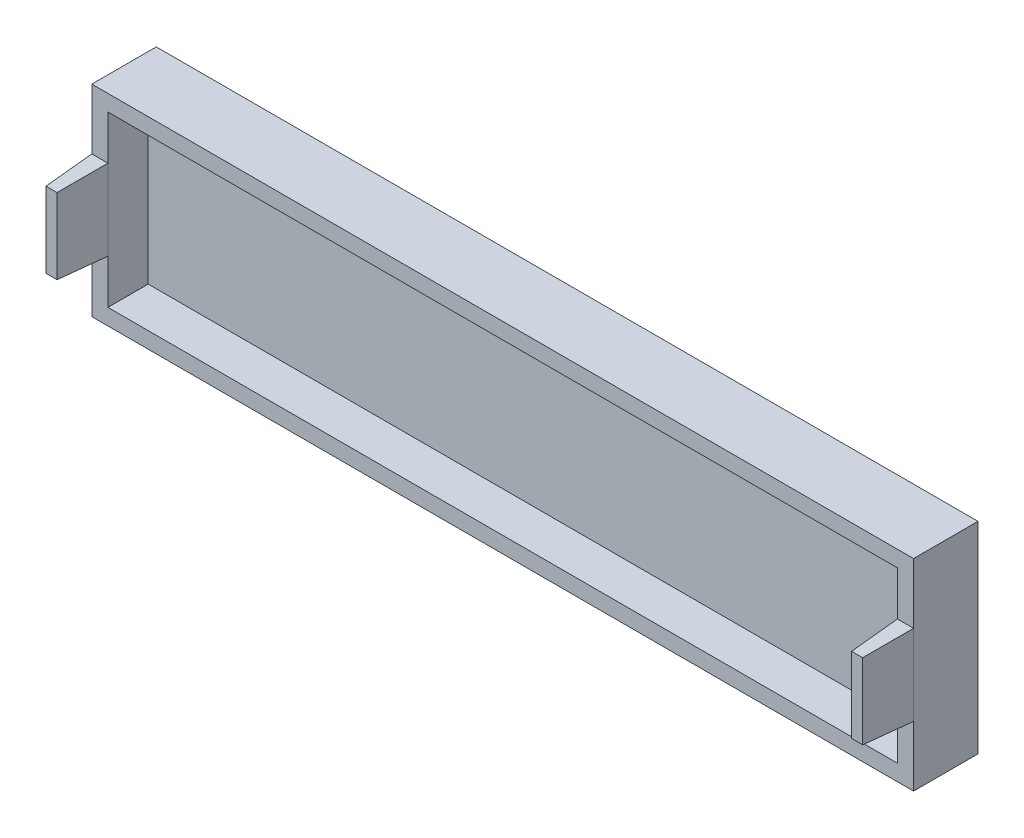
ISO-10303-21;
HEADER;
FILE_DESCRIPTION(('STEP AP214'),'2;1');
FILE_NAME('part.step','',(''),(''),'','','');
FILE_SCHEMA(('AUTOMOTIVE_DESIGN { 1 0 10303 214 1 1 1 1 }'));
ENDSEC;
DATA;
#1=APPLICATION_CONTEXT('core data for automotive mechanical design processes');
#2=APPLICATION_PROTOCOL_DEFINITION('international standard','automotive_design',2000,#1);
#3=PRODUCT_CONTEXT('',#1,'mechanical');
#4=PRODUCT('Part','Part','',(#3));
#5=PRODUCT_RELATED_PRODUCT_CATEGORY('part','',(#4));
#6=PRODUCT_DEFINITION_FORMATION('','',#4);
#7=PRODUCT_DEFINITION_CONTEXT('part definition',#1,'design');
#8=PRODUCT_DEFINITION('design','',#6,#7);
#9=PRODUCT_DEFINITION_SHAPE('','',#8);
#10=(LENGTH_UNIT() NAMED_UNIT(*) SI_UNIT(.MILLI.,.METRE.));
#11=(NAMED_UNIT(*) PLANE_ANGLE_UNIT() SI_UNIT($,.RADIAN.));
#12=(NAMED_UNIT(*) SI_UNIT($,.STERADIAN.) SOLID_ANGLE_UNIT());
#13=UNCERTAINTY_MEASURE_WITH_UNIT(LENGTH_MEASURE(1.E-05),#10,'distance_accuracy_value','');
#14=(GEOMETRIC_REPRESENTATION_CONTEXT(3) GLOBAL_UNCERTAINTY_ASSIGNED_CONTEXT((#13)) GLOBAL_UNIT_ASSIGNED_CONTEXT((#10,
#11,#12)) REPRESENTATION_CONTEXT('',''));
#15=CARTESIAN_POINT('',(0.,0.,0.));
#16=DIRECTION('',(0.,0.,1.));
#17=DIRECTION('',(1.,0.,0.));
#18=AXIS2_PLACEMENT_3D('',#15,#16,#17);
#19=CARTESIAN_POINT('',(0.,0.,8.));
#20=DIRECTION('',(0.,0.,1.));
#21=DIRECTION('',(1.,0.,0.));
#22=AXIS2_PLACEMENT_3D('',#19,#20,#21);
#23=PLANE('',#22);
#24=DIRECTION('',(1.,0.,0.));
#25=VECTOR('',#24,1.);
#26=CARTESIAN_POINT('',(51.,4.99999999999999,8.));
#27=LINE('',#26,#25);
#28=CARTESIAN_POINT('',(49.,4.99999999999999,8.));
#29=VERTEX_POINT('',#28);
#30=CARTESIAN_POINT('',(51.,4.99999999999999,8.));
#31=VERTEX_POINT('',#30);
#32=EDGE_CURVE('E49',#29,#31,#27,.T.);
#33=ORIENTED_EDGE('',*,*,#32,.T.);
#34=DIRECTION('',(0.,1.,0.));
#35=VECTOR('',#34,1.);
#36=CARTESIAN_POINT('',(51.,-12.5,8.));
#37=LINE('',#36,#35);
#38=CARTESIAN_POINT('',(51.,12.5,8.));
#39=VERTEX_POINT('',#38);
#40=EDGE_CURVE('E226',#31,#39,#37,.T.);
#41=ORIENTED_EDGE('',*,*,#40,.T.);
#42=DIRECTION('',(-1.,0.,0.));
#43=VECTOR('',#42,1.);
#44=CARTESIAN_POINT('',(51.,12.5,8.));
#45=LINE('',#44,#43);
#46=CARTESIAN_POINT('',(-51.,12.5,8.));
#47=VERTEX_POINT('',#46);
#48=EDGE_CURVE('E218',#39,#47,#45,.T.);
#49=ORIENTED_EDGE('',*,*,#48,.T.);
#50=DIRECTION('',(0.,-1.,0.));
#51=VECTOR('',#50,1.);
#52=CARTESIAN_POINT('',(-51.,12.5,8.));
#53=LINE('',#52,#51);
#54=CARTESIAN_POINT('',(-51.,4.99999999999999,8.));
#55=VERTEX_POINT('',#54);
#56=EDGE_CURVE('E222',#47,#55,#53,.T.);
#57=ORIENTED_EDGE('',*,*,#56,.T.);
#58=DIRECTION('',(-1.,0.,0.));
#59=VECTOR('',#58,1.);
#60=CARTESIAN_POINT('',(-51.,4.99999999999999,8.));
#61=LINE('',#60,#59);
#62=CARTESIAN_POINT('',(-49.,4.99999999999999,8.));
#63=VERTEX_POINT('',#62);
#64=EDGE_CURVE('E57',#63,#55,#61,.T.);
#65=ORIENTED_EDGE('',*,*,#64,.F.);
#66=DIRECTION('',(0.,-1.,0.));
#67=VECTOR('',#66,1.);
#68=CARTESIAN_POINT('',(-49.,10.5,8.));
#69=LINE('',#68,#67);
#70=CARTESIAN_POINT('',(-49.,10.5,8.));
#71=VERTEX_POINT('',#70);
#72=EDGE_CURVE('E196',#71,#63,#69,.T.);
#73=ORIENTED_EDGE('',*,*,#72,.F.);
#74=DIRECTION('',(-1.,0.,0.));
#75=VECTOR('',#74,1.);
#76=CARTESIAN_POINT('',(49.,10.5,8.));
#77=LINE('',#76,#75);
#78=CARTESIAN_POINT('',(49.,10.5,8.));
#79=VERTEX_POINT('',#78);
#80=EDGE_CURVE('E186',#79,#71,#77,.T.);
#81=ORIENTED_EDGE('',*,*,#80,.F.);
#82=DIRECTION('',(0.,1.,0.));
#83=VECTOR('',#82,1.);
#84=CARTESIAN_POINT('',(49.,-10.5,8.));
#85=LINE('',#84,#83);
#86=EDGE_CURVE('E187',#29,#79,#85,.T.);
#87=ORIENTED_EDGE('',*,*,#86,.F.);
#88=EDGE_LOOP('',(#33,#41,#49,#57,#65,#73,#81,#87));
#89=FACE_BOUND('',#88,.T.);
#90=ADVANCED_FACE('F34',(#89),#23,.T.);
#91=CARTESIAN_POINT('',(-51.,-12.5,3.));
#92=DIRECTION('',(1.,0.,0.));
#93=DIRECTION('',(0.,0.,-1.));
#94=AXIS2_PLACEMENT_3D('',#91,#92,#93);
#95=PLANE('',#94);
#96=DIRECTION('',(0.,-1.,0.));
#97=VECTOR('',#96,1.);
#98=CARTESIAN_POINT('',(-51.,-12.5,0.));
#99=LINE('',#98,#97);
#100=CARTESIAN_POINT('',(-51.,12.5,0.));
#101=VERTEX_POINT('',#100);
#102=CARTESIAN_POINT('',(-51.,-12.5,0.));
#103=VERTEX_POINT('',#102);
#104=EDGE_CURVE('E228',#101,#103,#99,.T.);
#105=ORIENTED_EDGE('',*,*,#104,.T.);
#106=DIRECTION('',(0.,0.,-1.));
#107=VECTOR('',#106,1.);
#108=CARTESIAN_POINT('',(-51.,-12.5,3.));
#109=LINE('',#108,#107);
#110=CARTESIAN_POINT('',(-51.,-12.5,8.));
#111=VERTEX_POINT('',#110);
#112=EDGE_CURVE('E11',#111,#103,#109,.T.);
#113=ORIENTED_EDGE('',*,*,#112,.F.);
#114=CARTESIAN_POINT('',(-51.,-5.00000000000001,8.));
#115=VERTEX_POINT('',#114);
#116=EDGE_CURVE('E221',#115,#111,#53,.T.);
#117=ORIENTED_EDGE('',*,*,#116,.F.);
#118=DIRECTION('',(0.,-1.,0.));
#119=VECTOR('',#118,1.);
#120=CARTESIAN_POINT('',(-51.,-5.00000000000001,8.));
#121=LINE('',#120,#119);
#122=EDGE_CURVE('E261',#55,#115,#121,.T.);
#123=ORIENTED_EDGE('',*,*,#122,.F.);
#124=ORIENTED_EDGE('',*,*,#56,.F.);
#125=DIRECTION('',(0.,0.,-1.));
#126=VECTOR('',#125,1.);
#127=CARTESIAN_POINT('',(-51.,12.5,3.));
#128=LINE('',#127,#126);
#129=EDGE_CURVE('E237',#47,#101,#128,.T.);
#130=ORIENTED_EDGE('',*,*,#129,.T.);
#131=EDGE_LOOP('',(#105,#113,#117,#123,#124,#130));
#132=FACE_BOUND('',#131,.T.);
#133=ADVANCED_FACE('F36',(#132),#95,.F.);
#134=CARTESIAN_POINT('',(51.,-12.5,3.));
#135=DIRECTION('',(0.,1.,0.));
#136=DIRECTION('',(-1.,0.,0.));
#137=AXIS2_PLACEMENT_3D('',#134,#135,#136);
#138=PLANE('',#137);
#139=DIRECTION('',(1.,0.,0.));
#140=VECTOR('',#139,1.);
#141=CARTESIAN_POINT('',(51.,-12.5,0.));
#142=LINE('',#141,#140);
#143=CARTESIAN_POINT('',(51.,-12.5,0.));
#144=VERTEX_POINT('',#143);
#145=EDGE_CURVE('E231',#103,#144,#142,.T.);
#146=ORIENTED_EDGE('',*,*,#145,.T.);
#147=DIRECTION('',(0.,0.,-1.));
#148=VECTOR('',#147,1.);
#149=CARTESIAN_POINT('',(51.,-12.5,3.));
#150=LINE('',#149,#148);
#151=CARTESIAN_POINT('',(51.,-12.5,8.));
#152=VERTEX_POINT('',#151);
#153=EDGE_CURVE('E42',#152,#144,#150,.T.);
#154=ORIENTED_EDGE('',*,*,#153,.F.);
#155=DIRECTION('',(1.,0.,0.));
#156=VECTOR('',#155,1.);
#157=CARTESIAN_POINT('',(-51.,-12.5,8.));
#158=LINE('',#157,#156);
#159=EDGE_CURVE('E224',#111,#152,#158,.T.);
#160=ORIENTED_EDGE('',*,*,#159,.F.);
#161=ORIENTED_EDGE('',*,*,#112,.T.);
#162=EDGE_LOOP('',(#146,#154,#160,#161));
#163=FACE_BOUND('',#162,.T.);
#164=ADVANCED_FACE('F322',(#163),#138,.F.);
#165=CARTESIAN_POINT('',(51.,-12.5,3.));
#166=DIRECTION('',(-1.,0.,0.));
#167=DIRECTION('',(0.,-1.,0.));
#168=AXIS2_PLACEMENT_3D('',#165,#166,#167);
#169=PLANE('',#168);
#170=DIRECTION('',(0.,1.,0.));
#171=VECTOR('',#170,1.);
#172=CARTESIAN_POINT('',(51.,-12.5,0.));
#173=LINE('',#172,#171);
#174=CARTESIAN_POINT('',(51.,12.5,0.));
#175=VERTEX_POINT('',#174);
#176=EDGE_CURVE('E233',#144,#175,#173,.T.);
#177=ORIENTED_EDGE('',*,*,#176,.T.);
#178=DIRECTION('',(0.,0.,-1.));
#179=VECTOR('',#178,1.);
#180=CARTESIAN_POINT('',(51.,12.5,3.));
#181=LINE('',#180,#179);
#182=EDGE_CURVE('E240',#39,#175,#181,.T.);
#183=ORIENTED_EDGE('',*,*,#182,.F.);
#184=ORIENTED_EDGE('',*,*,#40,.F.);
#185=DIRECTION('',(0.,-1.,0.));
#186=VECTOR('',#185,1.);
#187=CARTESIAN_POINT('',(51.,-5.00000000000001,8.));
#188=LINE('',#187,#186);
#189=CARTESIAN_POINT('',(51.,-5.00000000000001,8.));
#190=VERTEX_POINT('',#189);
#191=EDGE_CURVE('E179',#31,#190,#188,.T.);
#192=ORIENTED_EDGE('',*,*,#191,.T.);
#193=EDGE_CURVE('E178',#152,#190,#37,.T.);
#194=ORIENTED_EDGE('',*,*,#193,.F.);
#195=ORIENTED_EDGE('',*,*,#153,.T.);
#196=EDGE_LOOP('',(#177,#183,#184,#192,#194,#195));
#197=FACE_BOUND('',#196,.T.);
#198=ADVANCED_FACE('F245',(#197),#169,.F.);
#199=CARTESIAN_POINT('',(51.,12.5,3.));
#200=DIRECTION('',(0.,-1.,0.));
#201=DIRECTION('',(1.,0.,0.));
#202=AXIS2_PLACEMENT_3D('',#199,#200,#201);
#203=PLANE('',#202);
#204=DIRECTION('',(-1.,0.,0.));
#205=VECTOR('',#204,1.);
#206=CARTESIAN_POINT('',(51.,12.5,0.));
#207=LINE('',#206,#205);
#208=EDGE_CURVE('E235',#175,#101,#207,.T.);
#209=ORIENTED_EDGE('',*,*,#208,.T.);
#210=ORIENTED_EDGE('',*,*,#129,.F.);
#211=ORIENTED_EDGE('',*,*,#48,.F.);
#212=ORIENTED_EDGE('',*,*,#182,.T.);
#213=EDGE_LOOP('',(#209,#210,#211,#212));
#214=FACE_BOUND('',#213,.T.);
#215=ADVANCED_FACE('F254',(#214),#203,.F.);
#216=CARTESIAN_POINT('',(0.,0.,0.));
#217=DIRECTION('',(0.,0.,1.));
#218=DIRECTION('',(1.,0.,0.));
#219=AXIS2_PLACEMENT_3D('',#216,#217,#218);
#220=PLANE('',#219);
#221=ORIENTED_EDGE('',*,*,#104,.F.);
#222=ORIENTED_EDGE('',*,*,#208,.F.);
#223=ORIENTED_EDGE('',*,*,#176,.F.);
#224=ORIENTED_EDGE('',*,*,#145,.F.);
#225=EDGE_LOOP('',(#221,#222,#223,#224));
#226=FACE_BOUND('',#225,.T.);
#227=ADVANCED_FACE('F252',(#226),#220,.F.);
#228=DIRECTION('',(-1.,0.,0.));
#229=VECTOR('',#228,1.);
#230=CARTESIAN_POINT('',(49.,-5.00000000000001,8.));
#231=LINE('',#230,#229);
#232=CARTESIAN_POINT('',(49.,-5.00000000000001,8.));
#233=VERTEX_POINT('',#232);
#234=EDGE_CURVE('E153',#190,#233,#231,.T.);
#235=ORIENTED_EDGE('',*,*,#234,.T.);
#236=CARTESIAN_POINT('',(49.,-10.5,8.));
#237=VERTEX_POINT('',#236);
#238=EDGE_CURVE('E175',#237,#233,#85,.T.);
#239=ORIENTED_EDGE('',*,*,#238,.F.);
#240=DIRECTION('',(1.,0.,0.));
#241=VECTOR('',#240,1.);
#242=CARTESIAN_POINT('',(-49.,-10.5,8.));
#243=LINE('',#242,#241);
#244=CARTESIAN_POINT('',(-49.,-10.5,8.));
#245=VERTEX_POINT('',#244);
#246=EDGE_CURVE('E198',#245,#237,#243,.T.);
#247=ORIENTED_EDGE('',*,*,#246,.F.);
#248=CARTESIAN_POINT('',(-49.,-5.00000000000001,8.));
#249=VERTEX_POINT('',#248);
#250=EDGE_CURVE('E189',#249,#245,#69,.T.);
#251=ORIENTED_EDGE('',*,*,#250,.F.);
#252=DIRECTION('',(1.,0.,0.));
#253=VECTOR('',#252,1.);
#254=CARTESIAN_POINT('',(-49.,-5.00000000000001,8.));
#255=LINE('',#254,#253);
#256=EDGE_CURVE('E283',#115,#249,#255,.T.);
#257=ORIENTED_EDGE('',*,*,#256,.F.);
#258=ORIENTED_EDGE('',*,*,#116,.T.);
#259=ORIENTED_EDGE('',*,*,#159,.T.);
#260=ORIENTED_EDGE('',*,*,#193,.T.);
#261=EDGE_LOOP('',(#235,#239,#247,#251,#257,#258,#259,#260));
#262=FACE_BOUND('',#261,.T.);
#263=ADVANCED_FACE('F173',(#262),#23,.T.);
#264=CARTESIAN_POINT('',(49.,-10.5,8.));
#265=DIRECTION('',(-1.,0.,0.));
#266=DIRECTION('',(0.,0.,1.));
#267=AXIS2_PLACEMENT_3D('',#264,#265,#266);
#268=PLANE('',#267);
#269=DIRECTION('',(0.,1.,0.));
#270=VECTOR('',#269,1.);
#271=CARTESIAN_POINT('',(49.,-10.5,3.));
#272=LINE('',#271,#270);
#273=CARTESIAN_POINT('',(49.,-10.5,3.));
#274=VERTEX_POINT('',#273);
#275=CARTESIAN_POINT('',(49.,10.5,3.));
#276=VERTEX_POINT('',#275);
#277=EDGE_CURVE('E200',#274,#276,#272,.T.);
#278=ORIENTED_EDGE('',*,*,#277,.F.);
#279=DIRECTION('',(0.,0.,-1.));
#280=VECTOR('',#279,1.);
#281=CARTESIAN_POINT('',(49.,-10.5,8.));
#282=LINE('',#281,#280);
#283=EDGE_CURVE('E185',#237,#274,#282,.T.);
#284=ORIENTED_EDGE('',*,*,#283,.F.);
#285=ORIENTED_EDGE('',*,*,#238,.T.);
#286=DIRECTION('',(0.,1.,0.));
#287=VECTOR('',#286,1.);
#288=CARTESIAN_POINT('',(49.,4.99999999999999,8.));
#289=LINE('',#288,#287);
#290=EDGE_CURVE('E164',#233,#29,#289,.T.);
#291=ORIENTED_EDGE('',*,*,#290,.T.);
#292=ORIENTED_EDGE('',*,*,#86,.T.);
#293=DIRECTION('',(0.,0.,-1.));
#294=VECTOR('',#293,1.);
#295=CARTESIAN_POINT('',(49.,10.5,8.));
#296=LINE('',#295,#294);
#297=EDGE_CURVE('E215',#79,#276,#296,.T.);
#298=ORIENTED_EDGE('',*,*,#297,.T.);
#299=EDGE_LOOP('',(#278,#284,#285,#291,#292,#298));
#300=FACE_BOUND('',#299,.T.);
#301=ADVANCED_FACE('F183',(#300),#268,.T.);
#302=CARTESIAN_POINT('',(49.,10.5,8.));
#303=DIRECTION('',(0.,-1.,0.));
#304=DIRECTION('',(0.,0.,-1.));
#305=AXIS2_PLACEMENT_3D('',#302,#303,#304);
#306=PLANE('',#305);
#307=DIRECTION('',(-1.,0.,0.));
#308=VECTOR('',#307,1.);
#309=CARTESIAN_POINT('',(49.,10.5,3.));
#310=LINE('',#309,#308);
#311=CARTESIAN_POINT('',(-49.,10.5,3.));
#312=VERTEX_POINT('',#311);
#313=EDGE_CURVE('E202',#276,#312,#310,.T.);
#314=ORIENTED_EDGE('',*,*,#313,.F.);
#315=ORIENTED_EDGE('',*,*,#297,.F.);
#316=ORIENTED_EDGE('',*,*,#80,.T.);
#317=DIRECTION('',(0.,0.,-1.));
#318=VECTOR('',#317,1.);
#319=CARTESIAN_POINT('',(-49.,10.5,8.));
#320=LINE('',#319,#318);
#321=EDGE_CURVE('E212',#71,#312,#320,.T.);
#322=ORIENTED_EDGE('',*,*,#321,.T.);
#323=EDGE_LOOP('',(#314,#315,#316,#322));
#324=FACE_BOUND('',#323,.T.);
#325=ADVANCED_FACE('F341',(#324),#306,.T.);
#326=CARTESIAN_POINT('',(-49.,10.5,8.));
#327=DIRECTION('',(1.,0.,0.));
#328=DIRECTION('',(0.,0.,-1.));
#329=AXIS2_PLACEMENT_3D('',#326,#327,#328);
#330=PLANE('',#329);
#331=DIRECTION('',(0.,-1.,0.));
#332=VECTOR('',#331,1.);
#333=CARTESIAN_POINT('',(-49.,10.5,3.));
#334=LINE('',#333,#332);
#335=CARTESIAN_POINT('',(-49.,-10.5,3.));
#336=VERTEX_POINT('',#335);
#337=EDGE_CURVE('E205',#312,#336,#334,.T.);
#338=ORIENTED_EDGE('',*,*,#337,.F.);
#339=ORIENTED_EDGE('',*,*,#321,.F.);
#340=ORIENTED_EDGE('',*,*,#72,.T.);
#341=DIRECTION('',(0.,1.,0.));
#342=VECTOR('',#341,1.);
#343=CARTESIAN_POINT('',(-49.,4.99999999999999,8.));
#344=LINE('',#343,#342);
#345=EDGE_CURVE('E286',#249,#63,#344,.T.);
#346=ORIENTED_EDGE('',*,*,#345,.F.);
#347=ORIENTED_EDGE('',*,*,#250,.T.);
#348=DIRECTION('',(0.,0.,-1.));
#349=VECTOR('',#348,1.);
#350=CARTESIAN_POINT('',(-49.,-10.5,8.));
#351=LINE('',#350,#349);
#352=EDGE_CURVE('E209',#245,#336,#351,.T.);
#353=ORIENTED_EDGE('',*,*,#352,.T.);
#354=EDGE_LOOP('',(#338,#339,#340,#346,#347,#353));
#355=FACE_BOUND('',#354,.T.);
#356=ADVANCED_FACE('F357',(#355),#330,.T.);
#357=CARTESIAN_POINT('',(-49.,-10.5,8.));
#358=DIRECTION('',(0.,1.,0.));
#359=DIRECTION('',(0.,0.,1.));
#360=AXIS2_PLACEMENT_3D('',#357,#358,#359);
#361=PLANE('',#360);
#362=DIRECTION('',(1.,0.,0.));
#363=VECTOR('',#362,1.);
#364=CARTESIAN_POINT('',(-49.,-10.5,3.));
#365=LINE('',#364,#363);
#366=EDGE_CURVE('E191',#336,#274,#365,.T.);
#367=ORIENTED_EDGE('',*,*,#366,.F.);
#368=ORIENTED_EDGE('',*,*,#352,.F.);
#369=ORIENTED_EDGE('',*,*,#246,.T.);
#370=ORIENTED_EDGE('',*,*,#283,.T.);
#371=EDGE_LOOP('',(#367,#368,#369,#370));
#372=FACE_BOUND('',#371,.T.);
#373=ADVANCED_FACE('F349',(#372),#361,.T.);
#374=CARTESIAN_POINT('',(0.,0.,3.));
#375=DIRECTION('',(0.,0.,1.));
#376=DIRECTION('',(1.,0.,0.));
#377=AXIS2_PLACEMENT_3D('',#374,#375,#376);
#378=PLANE('',#377);
#379=ORIENTED_EDGE('',*,*,#277,.T.);
#380=ORIENTED_EDGE('',*,*,#313,.T.);
#381=ORIENTED_EDGE('',*,*,#337,.T.);
#382=ORIENTED_EDGE('',*,*,#366,.T.);
#383=EDGE_LOOP('',(#379,#380,#381,#382));
#384=FACE_BOUND('',#383,.T.);
#385=ADVANCED_FACE('F347',(#384),#378,.T.);
#386=CARTESIAN_POINT('',(-51.,4.99999999999999,8.));
#387=DIRECTION('',(0.,0.998629534754574,0.0523359562429439));
#388=DIRECTION('',(0.,-0.0523359562429439,0.998629534754574));
#389=AXIS2_PLACEMENT_3D('',#386,#387,#388);
#390=PLANE('',#389);
#391=ORIENTED_EDGE('',*,*,#64,.T.);
#392=DIRECTION('',(-0.052264427688714,0.052264427688714,-0.997264688634237));
#393=VECTOR('',#392,1.);
#394=CARTESIAN_POINT('',(-50.9726842959837,4.9726842959837,8.52121468205632));
#395=LINE('',#394,#393);
#396=CARTESIAN_POINT('',(-50.6855533243018,4.68555332430174,14.));
#397=VERTEX_POINT('',#396);
#398=EDGE_CURVE('E203',#397,#55,#395,.T.);
#399=ORIENTED_EDGE('',*,*,#398,.F.);
#400=DIRECTION('',(1.,0.,0.));
#401=VECTOR('',#400,1.);
#402=CARTESIAN_POINT('',(0.,4.68555332430174,14.));
#403=LINE('',#402,#401);
#404=CARTESIAN_POINT('',(-49.3144466756983,4.68555332430174,14.));
#405=VERTEX_POINT('',#404);
#406=EDGE_CURVE('E289',#405,#397,#403,.F.);
#407=ORIENTED_EDGE('',*,*,#406,.F.);
#408=DIRECTION('',(0.052264427688714,0.052264427688714,-0.997264688634237));
#409=VECTOR('',#408,1.);
#410=CARTESIAN_POINT('',(-49.0054631408033,4.99453685919673,8.10424293641126));
#411=LINE('',#410,#409);
#412=EDGE_CURVE('E292',#405,#63,#411,.T.);
#413=ORIENTED_EDGE('',*,*,#412,.T.);
#414=EDGE_LOOP('',(#391,#399,#407,#413));
#415=FACE_BOUND('',#414,.T.);
#416=ADVANCED_FACE('F315',(#415),#390,.T.);
#417=CARTESIAN_POINT('',(-51.,-5.00000000000001,8.));
#418=DIRECTION('',(-0.998629534754574,0.,0.0523359562429439));
#419=DIRECTION('',(0.0523359562429439,0.,0.998629534754574));
#420=AXIS2_PLACEMENT_3D('',#417,#418,#419);
#421=PLANE('',#420);
#422=ORIENTED_EDGE('',*,*,#122,.T.);
#423=DIRECTION('',(-0.052264427688714,-0.052264427688714,-0.997264688634237));
#424=VECTOR('',#423,1.);
#425=CARTESIAN_POINT('',(-50.9945368591968,-4.99453685919675,8.10424293641126));
#426=LINE('',#425,#424);
#427=CARTESIAN_POINT('',(-50.6855533243018,-4.68555332430176,14.));
#428=VERTEX_POINT('',#427);
#429=EDGE_CURVE('E291',#428,#115,#426,.T.);
#430=ORIENTED_EDGE('',*,*,#429,.F.);
#431=DIRECTION('',(0.,1.,0.));
#432=VECTOR('',#431,1.);
#433=CARTESIAN_POINT('',(-50.6855533243018,0.,14.));
#434=LINE('',#433,#432);
#435=EDGE_CURVE('E302',#397,#428,#434,.F.);
#436=ORIENTED_EDGE('',*,*,#435,.F.);
#437=ORIENTED_EDGE('',*,*,#398,.T.);
#438=EDGE_LOOP('',(#422,#430,#436,#437));
#439=FACE_BOUND('',#438,.T.);
#440=ADVANCED_FACE('F317',(#439),#421,.T.);
#441=CARTESIAN_POINT('',(-49.,-5.00000000000001,8.));
#442=DIRECTION('',(0.,-0.998629534754574,0.0523359562429439));
#443=DIRECTION('',(0.,-0.0523359562429439,-0.998629534754574));
#444=AXIS2_PLACEMENT_3D('',#441,#442,#443);
#445=PLANE('',#444);
#446=ORIENTED_EDGE('',*,*,#256,.T.);
#447=DIRECTION('',(0.052264427688714,-0.0522644276887139,-0.997264688634237));
#448=VECTOR('',#447,1.);
#449=CARTESIAN_POINT('',(-49.0273157040163,-4.97268429598372,8.52121468205632));
#450=LINE('',#449,#448);
#451=CARTESIAN_POINT('',(-49.3144466756983,-4.68555332430176,14.));
#452=VERTEX_POINT('',#451);
#453=EDGE_CURVE('E295',#452,#249,#450,.T.);
#454=ORIENTED_EDGE('',*,*,#453,.F.);
#455=DIRECTION('',(-1.,0.,0.));
#456=VECTOR('',#455,1.);
#457=CARTESIAN_POINT('',(0.,-4.68555332430174,14.));
#458=LINE('',#457,#456);
#459=EDGE_CURVE('E303',#428,#452,#458,.F.);
#460=ORIENTED_EDGE('',*,*,#459,.F.);
#461=ORIENTED_EDGE('',*,*,#429,.T.);
#462=EDGE_LOOP('',(#446,#454,#460,#461));
#463=FACE_BOUND('',#462,.T.);
#464=ADVANCED_FACE('F320',(#463),#445,.T.);
#465=CARTESIAN_POINT('',(-49.,4.99999999999999,8.));
#466=DIRECTION('',(0.998629534754574,0.,0.0523359562429439));
#467=DIRECTION('',(0.0523359562429439,0.,-0.998629534754574));
#468=AXIS2_PLACEMENT_3D('',#465,#466,#467);
#469=PLANE('',#468);
#470=ORIENTED_EDGE('',*,*,#345,.T.);
#471=ORIENTED_EDGE('',*,*,#412,.F.);
#472=DIRECTION('',(0.,-1.,0.));
#473=VECTOR('',#472,1.);
#474=CARTESIAN_POINT('',(-49.3144466756982,0.,14.));
#475=LINE('',#474,#473);
#476=EDGE_CURVE('E193',#452,#405,#475,.F.);
#477=ORIENTED_EDGE('',*,*,#476,.F.);
#478=ORIENTED_EDGE('',*,*,#453,.T.);
#479=EDGE_LOOP('',(#470,#471,#477,#478));
#480=FACE_BOUND('',#479,.T.);
#481=ADVANCED_FACE('F313',(#480),#469,.T.);
#482=CARTESIAN_POINT('',(0.,0.,14.));
#483=DIRECTION('',(0.,0.,-1.));
#484=DIRECTION('',(-1.,0.,0.));
#485=AXIS2_PLACEMENT_3D('',#482,#483,#484);
#486=PLANE('',#485);
#487=ORIENTED_EDGE('',*,*,#406,.T.);
#488=ORIENTED_EDGE('',*,*,#435,.T.);
#489=ORIENTED_EDGE('',*,*,#459,.T.);
#490=ORIENTED_EDGE('',*,*,#476,.T.);
#491=EDGE_LOOP('',(#487,#488,#489,#490));
#492=FACE_BOUND('',#491,.T.);
#493=ADVANCED_FACE('F309',(#492),#486,.F.);
#494=CARTESIAN_POINT('',(51.,4.99999999999999,8.));
#495=DIRECTION('',(0.,0.998629534754574,0.0523359562429439));
#496=DIRECTION('',(0.,-0.0523359562429439,0.998629534754574));
#497=AXIS2_PLACEMENT_3D('',#494,#495,#496);
#498=PLANE('',#497);
#499=ORIENTED_EDGE('',*,*,#32,.F.);
#500=DIRECTION('',(-0.052264427688714,0.052264427688714,-0.997264688634237));
#501=VECTOR('',#500,1.);
#502=CARTESIAN_POINT('',(49.,4.99999999999999,8.));
#503=LINE('',#502,#501);
#504=CARTESIAN_POINT('',(49.3144466756983,4.68555332430174,14.));
#505=VERTEX_POINT('',#504);
#506=EDGE_CURVE('E160',#505,#29,#503,.T.);
#507=ORIENTED_EDGE('',*,*,#506,.F.);
#508=DIRECTION('',(1.,0.,0.));
#509=VECTOR('',#508,1.);
#510=CARTESIAN_POINT('',(0.,4.68555332430174,14.));
#511=LINE('',#510,#509);
#512=CARTESIAN_POINT('',(50.6855533243018,4.68555332430174,14.));
#513=VERTEX_POINT('',#512);
#514=EDGE_CURVE('E266',#505,#513,#511,.T.);
#515=ORIENTED_EDGE('',*,*,#514,.T.);
#516=DIRECTION('',(0.052264427688714,0.052264427688714,-0.997264688634237));
#517=VECTOR('',#516,1.);
#518=CARTESIAN_POINT('',(51.,4.99999999999999,8.));
#519=LINE('',#518,#517);
#520=EDGE_CURVE('E273',#513,#31,#519,.T.);
#521=ORIENTED_EDGE('',*,*,#520,.T.);
#522=EDGE_LOOP('',(#499,#507,#515,#521));
#523=FACE_BOUND('',#522,.T.);
#524=ADVANCED_FACE('F384',(#523),#498,.T.);
#525=CARTESIAN_POINT('',(49.,4.99999999999999,8.));
#526=DIRECTION('',(-0.998629534754574,0.,0.0523359562429439));
#527=DIRECTION('',(0.0523359562429439,0.,0.998629534754574));
#528=AXIS2_PLACEMENT_3D('',#525,#526,#527);
#529=PLANE('',#528);
#530=ORIENTED_EDGE('',*,*,#290,.F.);
#531=DIRECTION('',(-0.052264427688714,-0.0522644276887139,-0.997264688634237));
#532=VECTOR('',#531,1.);
#533=CARTESIAN_POINT('',(49.,-5.00000000000001,8.));
#534=LINE('',#533,#532);
#535=CARTESIAN_POINT('',(49.3144466756983,-4.68555332430176,14.));
#536=VERTEX_POINT('',#535);
#537=EDGE_CURVE('E149',#536,#233,#534,.T.);
#538=ORIENTED_EDGE('',*,*,#537,.F.);
#539=DIRECTION('',(0.,1.,0.));
#540=VECTOR('',#539,1.);
#541=CARTESIAN_POINT('',(49.3144466756982,0.,14.));
#542=LINE('',#541,#540);
#543=EDGE_CURVE('E269',#536,#505,#542,.T.);
#544=ORIENTED_EDGE('',*,*,#543,.T.);
#545=ORIENTED_EDGE('',*,*,#506,.T.);
#546=EDGE_LOOP('',(#530,#538,#544,#545));
#547=FACE_BOUND('',#546,.T.);
#548=ADVANCED_FACE('F165',(#547),#529,.T.);
#549=CARTESIAN_POINT('',(49.,-5.00000000000001,8.));
#550=DIRECTION('',(0.,-0.998629534754574,0.0523359562429439));
#551=DIRECTION('',(0.,-0.0523359562429439,-0.998629534754574));
#552=AXIS2_PLACEMENT_3D('',#549,#550,#551);
#553=PLANE('',#552);
#554=ORIENTED_EDGE('',*,*,#234,.F.);
#555=DIRECTION('',(0.052264427688714,-0.052264427688714,-0.997264688634237));
#556=VECTOR('',#555,1.);
#557=CARTESIAN_POINT('',(51.,-5.00000000000001,8.));
#558=LINE('',#557,#556);
#559=CARTESIAN_POINT('',(50.6855533243018,-4.68555332430176,14.));
#560=VERTEX_POINT('',#559);
#561=EDGE_CURVE('E161',#560,#190,#558,.T.);
#562=ORIENTED_EDGE('',*,*,#561,.F.);
#563=DIRECTION('',(-1.,0.,0.));
#564=VECTOR('',#563,1.);
#565=CARTESIAN_POINT('',(0.,-4.68555332430174,14.));
#566=LINE('',#565,#564);
#567=EDGE_CURVE('E156',#560,#536,#566,.T.);
#568=ORIENTED_EDGE('',*,*,#567,.T.);
#569=ORIENTED_EDGE('',*,*,#537,.T.);
#570=EDGE_LOOP('',(#554,#562,#568,#569));
#571=FACE_BOUND('',#570,.T.);
#572=ADVANCED_FACE('F151',(#571),#553,.T.);
#573=CARTESIAN_POINT('',(51.,-5.00000000000001,8.));
#574=DIRECTION('',(0.998629534754574,0.,0.0523359562429439));
#575=DIRECTION('',(0.0523359562429439,0.,-0.998629534754574));
#576=AXIS2_PLACEMENT_3D('',#573,#574,#575);
#577=PLANE('',#576);
#578=ORIENTED_EDGE('',*,*,#191,.F.);
#579=ORIENTED_EDGE('',*,*,#520,.F.);
#580=DIRECTION('',(0.,-1.,0.));
#581=VECTOR('',#580,1.);
#582=CARTESIAN_POINT('',(50.6855533243018,0.,14.));
#583=LINE('',#582,#581);
#584=EDGE_CURVE('E275',#513,#560,#583,.T.);
#585=ORIENTED_EDGE('',*,*,#584,.T.);
#586=ORIENTED_EDGE('',*,*,#561,.T.);
#587=EDGE_LOOP('',(#578,#579,#585,#586));
#588=FACE_BOUND('',#587,.T.);
#589=ADVANCED_FACE('F389',(#588),#577,.T.);
#590=CARTESIAN_POINT('',(0.,0.,14.));
#591=DIRECTION('',(0.,0.,-1.));
#592=DIRECTION('',(1.,0.,0.));
#593=AXIS2_PLACEMENT_3D('',#590,#591,#592);
#594=PLANE('',#593);
#595=ORIENTED_EDGE('',*,*,#514,.F.);
#596=ORIENTED_EDGE('',*,*,#543,.F.);
#597=ORIENTED_EDGE('',*,*,#567,.F.);
#598=ORIENTED_EDGE('',*,*,#584,.F.);
#599=EDGE_LOOP('',(#595,#596,#597,#598));
#600=FACE_BOUND('',#599,.T.);
#601=ADVANCED_FACE('F392',(#600),#594,.F.);
#602=CLOSED_SHELL('',(#90,#133,#164,#198,#215,#227,#263,#301,#325,#356,#373,#385,#416,#440,#464,
#481,#493,#524,#548,#572,#589,#601));
#603=MANIFOLD_SOLID_BREP('B2',#602);
#604=ADVANCED_BREP_SHAPE_REPRESENTATION('',(#18,#603),#14);
#605=SHAPE_DEFINITION_REPRESENTATION(#9,#604);
ENDSEC;
END-ISO-10303-21;
